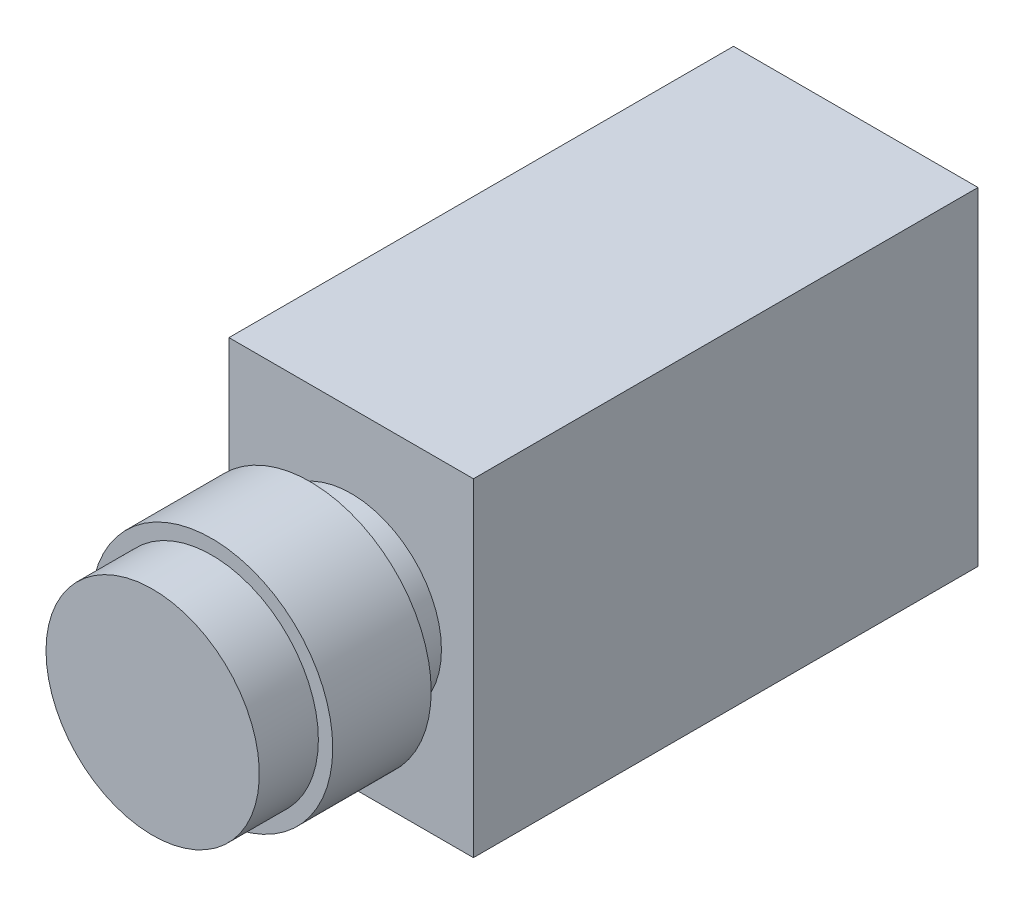
ISO-10303-21;
HEADER;
FILE_DESCRIPTION(('STEP AP214'),'2;1');
FILE_NAME('part.step','',(''),(''),'','','');
FILE_SCHEMA(('AUTOMOTIVE_DESIGN { 1 0 10303 214 1 1 1 1 }'));
ENDSEC;
DATA;
#1=APPLICATION_CONTEXT('core data for automotive mechanical design processes');
#2=APPLICATION_PROTOCOL_DEFINITION('international standard','automotive_design',2000,#1);
#3=PRODUCT_CONTEXT('',#1,'mechanical');
#4=PRODUCT('Part','Part','',(#3));
#5=PRODUCT_RELATED_PRODUCT_CATEGORY('part','',(#4));
#6=PRODUCT_DEFINITION_FORMATION('','',#4);
#7=PRODUCT_DEFINITION_CONTEXT('part definition',#1,'design');
#8=PRODUCT_DEFINITION('design','',#6,#7);
#9=PRODUCT_DEFINITION_SHAPE('','',#8);
#10=(LENGTH_UNIT() NAMED_UNIT(*) SI_UNIT(.MILLI.,.METRE.));
#11=(NAMED_UNIT(*) PLANE_ANGLE_UNIT() SI_UNIT($,.RADIAN.));
#12=(NAMED_UNIT(*) SI_UNIT($,.STERADIAN.) SOLID_ANGLE_UNIT());
#13=UNCERTAINTY_MEASURE_WITH_UNIT(LENGTH_MEASURE(1.E-05),#10,'distance_accuracy_value','');
#14=(GEOMETRIC_REPRESENTATION_CONTEXT(3) GLOBAL_UNCERTAINTY_ASSIGNED_CONTEXT((#13)) GLOBAL_UNIT_ASSIGNED_CONTEXT((#10,
#11,#12)) REPRESENTATION_CONTEXT('',''));
#15=CARTESIAN_POINT('',(0.,0.,0.));
#16=DIRECTION('',(0.,0.,1.));
#17=DIRECTION('',(1.,0.,0.));
#18=AXIS2_PLACEMENT_3D('',#15,#16,#17);
#19=CARTESIAN_POINT('',(-14.9,20.,-66.5));
#20=DIRECTION('',(1.,0.,0.));
#21=DIRECTION('',(0.,1.,0.));
#22=AXIS2_PLACEMENT_3D('',#19,#20,#21);
#23=PLANE('',#22);
#24=DIRECTION('',(0.,1.,0.));
#25=VECTOR('',#24,1.);
#26=CARTESIAN_POINT('',(-14.9,20.,-5.));
#27=LINE('',#26,#25);
#28=CARTESIAN_POINT('',(-14.9,-20.,-5.));
#29=VERTEX_POINT('',#28);
#30=CARTESIAN_POINT('',(-14.9,20.,-5.));
#31=VERTEX_POINT('',#30);
#32=EDGE_CURVE('E103',#29,#31,#27,.T.);
#33=ORIENTED_EDGE('',*,*,#32,.T.);
#34=DIRECTION('',(0.,0.,1.));
#35=VECTOR('',#34,1.);
#36=CARTESIAN_POINT('',(-14.9,20.,-66.5));
#37=LINE('',#36,#35);
#38=CARTESIAN_POINT('',(-14.9,20.,-66.5));
#39=VERTEX_POINT('',#38);
#40=EDGE_CURVE('E12',#39,#31,#37,.T.);
#41=ORIENTED_EDGE('',*,*,#40,.F.);
#42=DIRECTION('',(0.,1.,0.));
#43=VECTOR('',#42,1.);
#44=CARTESIAN_POINT('',(-14.9,20.,-66.5));
#45=LINE('',#44,#43);
#46=CARTESIAN_POINT('',(-14.9,-20.,-66.5));
#47=VERTEX_POINT('',#46);
#48=EDGE_CURVE('E91',#47,#39,#45,.T.);
#49=ORIENTED_EDGE('',*,*,#48,.F.);
#50=DIRECTION('',(0.,0.,1.));
#51=VECTOR('',#50,1.);
#52=CARTESIAN_POINT('',(-14.9,-20.,-66.5));
#53=LINE('',#52,#51);
#54=EDGE_CURVE('E99',#47,#29,#53,.T.);
#55=ORIENTED_EDGE('',*,*,#54,.T.);
#56=EDGE_LOOP('',(#33,#41,#49,#55));
#57=FACE_BOUND('',#56,.T.);
#58=ADVANCED_FACE('F40',(#57),#23,.F.);
#59=CARTESIAN_POINT('',(14.9,20.,-66.5));
#60=DIRECTION('',(0.,-1.,0.));
#61=DIRECTION('',(0.,0.,-1.));
#62=AXIS2_PLACEMENT_3D('',#59,#60,#61);
#63=PLANE('',#62);
#64=DIRECTION('',(1.,0.,0.));
#65=VECTOR('',#64,1.);
#66=CARTESIAN_POINT('',(14.9,20.,-5.));
#67=LINE('',#66,#65);
#68=CARTESIAN_POINT('',(14.9,20.,-5.));
#69=VERTEX_POINT('',#68);
#70=EDGE_CURVE('E95',#31,#69,#67,.T.);
#71=ORIENTED_EDGE('',*,*,#70,.T.);
#72=DIRECTION('',(0.,0.,1.));
#73=VECTOR('',#72,1.);
#74=CARTESIAN_POINT('',(14.9,20.,-66.5));
#75=LINE('',#74,#73);
#76=CARTESIAN_POINT('',(14.9,20.,-66.5));
#77=VERTEX_POINT('',#76);
#78=EDGE_CURVE('E48',#77,#69,#75,.T.);
#79=ORIENTED_EDGE('',*,*,#78,.F.);
#80=DIRECTION('',(1.,0.,0.));
#81=VECTOR('',#80,1.);
#82=CARTESIAN_POINT('',(14.9,20.,-66.5));
#83=LINE('',#82,#81);
#84=EDGE_CURVE('E86',#39,#77,#83,.T.);
#85=ORIENTED_EDGE('',*,*,#84,.F.);
#86=ORIENTED_EDGE('',*,*,#40,.T.);
#87=EDGE_LOOP('',(#71,#79,#85,#86));
#88=FACE_BOUND('',#87,.T.);
#89=ADVANCED_FACE('F94',(#88),#63,.F.);
#90=CARTESIAN_POINT('',(14.9,20.,-66.5));
#91=DIRECTION('',(-1.,0.,0.));
#92=DIRECTION('',(0.,-1.,0.));
#93=AXIS2_PLACEMENT_3D('',#90,#91,#92);
#94=PLANE('',#93);
#95=DIRECTION('',(0.,-1.,0.));
#96=VECTOR('',#95,1.);
#97=CARTESIAN_POINT('',(14.9,20.,-5.));
#98=LINE('',#97,#96);
#99=CARTESIAN_POINT('',(14.9,-20.,-5.));
#100=VERTEX_POINT('',#99);
#101=EDGE_CURVE('E73',#69,#100,#98,.T.);
#102=ORIENTED_EDGE('',*,*,#101,.T.);
#103=DIRECTION('',(0.,0.,1.));
#104=VECTOR('',#103,1.);
#105=CARTESIAN_POINT('',(14.9,-20.,-66.5));
#106=LINE('',#105,#104);
#107=CARTESIAN_POINT('',(14.9,-20.,-66.5));
#108=VERTEX_POINT('',#107);
#109=EDGE_CURVE('E96',#108,#100,#106,.T.);
#110=ORIENTED_EDGE('',*,*,#109,.F.);
#111=DIRECTION('',(0.,-1.,0.));
#112=VECTOR('',#111,1.);
#113=CARTESIAN_POINT('',(14.9,20.,-66.5));
#114=LINE('',#113,#112);
#115=EDGE_CURVE('E89',#77,#108,#114,.T.);
#116=ORIENTED_EDGE('',*,*,#115,.F.);
#117=ORIENTED_EDGE('',*,*,#78,.T.);
#118=EDGE_LOOP('',(#102,#110,#116,#117));
#119=FACE_BOUND('',#118,.T.);
#120=ADVANCED_FACE('F97',(#119),#94,.F.);
#121=CARTESIAN_POINT('',(14.9,-20.,-66.5));
#122=DIRECTION('',(0.,1.,0.));
#123=DIRECTION('',(0.,0.,1.));
#124=AXIS2_PLACEMENT_3D('',#121,#122,#123);
#125=PLANE('',#124);
#126=DIRECTION('',(-1.,0.,0.));
#127=VECTOR('',#126,1.);
#128=CARTESIAN_POINT('',(14.9,-20.,-5.));
#129=LINE('',#128,#127);
#130=EDGE_CURVE('E79',#100,#29,#129,.T.);
#131=ORIENTED_EDGE('',*,*,#130,.T.);
#132=ORIENTED_EDGE('',*,*,#54,.F.);
#133=DIRECTION('',(-1.,0.,0.));
#134=VECTOR('',#133,1.);
#135=CARTESIAN_POINT('',(14.9,-20.,-66.5));
#136=LINE('',#135,#134);
#137=EDGE_CURVE('E56',#108,#47,#136,.T.);
#138=ORIENTED_EDGE('',*,*,#137,.F.);
#139=ORIENTED_EDGE('',*,*,#109,.T.);
#140=EDGE_LOOP('',(#131,#132,#138,#139));
#141=FACE_BOUND('',#140,.T.);
#142=ADVANCED_FACE('F110',(#141),#125,.F.);
#143=CARTESIAN_POINT('',(0.,0.,-66.5));
#144=DIRECTION('',(0.,0.,-1.));
#145=DIRECTION('',(-1.,0.,0.));
#146=AXIS2_PLACEMENT_3D('',#143,#144,#145);
#147=PLANE('',#146);
#148=ORIENTED_EDGE('',*,*,#48,.T.);
#149=ORIENTED_EDGE('',*,*,#84,.T.);
#150=ORIENTED_EDGE('',*,*,#115,.T.);
#151=ORIENTED_EDGE('',*,*,#137,.T.);
#152=EDGE_LOOP('',(#148,#149,#150,#151));
#153=FACE_BOUND('',#152,.T.);
#154=ADVANCED_FACE('F87',(#153),#147,.T.);
#155=CARTESIAN_POINT('',(0.,0.,-5.));
#156=DIRECTION('',(0.,0.,-1.));
#157=DIRECTION('',(-1.,0.,0.));
#158=AXIS2_PLACEMENT_3D('',#155,#156,#157);
#159=PLANE('',#158);
#160=ORIENTED_EDGE('',*,*,#32,.F.);
#161=ORIENTED_EDGE('',*,*,#130,.F.);
#162=ORIENTED_EDGE('',*,*,#101,.F.);
#163=ORIENTED_EDGE('',*,*,#70,.F.);
#164=EDGE_LOOP('',(#160,#161,#162,#163));
#165=FACE_BOUND('',#164,.T.);
#166=ADVANCED_FACE('F113',(#165),#159,.F.);
#167=CLOSED_SHELL('',(#58,#89,#120,#142,#154,#166));
#168=MANIFOLD_SOLID_BREP('B2',#167);
#169=CARTESIAN_POINT('',(0.,0.,0.));
#170=DIRECTION('',(0.,0.,1.));
#171=DIRECTION('',(1.,0.,0.));
#172=AXIS2_PLACEMENT_3D('',#169,#170,#171);
#173=PLANE('',#172);
#174=CARTESIAN_POINT('',(0.,0.,0.));
#175=DIRECTION('',(0.,0.,1.));
#176=DIRECTION('',(1.,0.,0.));
#177=AXIS2_PLACEMENT_3D('',#174,#175,#176);
#178=CIRCLE('',#177,14.75);
#179=CARTESIAN_POINT('',(14.75,0.,0.));
#180=VERTEX_POINT('',#179);
#181=EDGE_CURVE('E179',#180,#180,#178,.T.);
#182=ORIENTED_EDGE('',*,*,#181,.F.);
#183=EDGE_LOOP('',(#182));
#184=FACE_BOUND('',#183,.T.);
#185=CARTESIAN_POINT('',(0.,0.,0.));
#186=DIRECTION('',(0.,0.,1.));
#187=DIRECTION('',(1.,0.,0.));
#188=AXIS2_PLACEMENT_3D('',#185,#186,#187);
#189=CIRCLE('',#188,11.);
#190=CARTESIAN_POINT('',(11.,0.,0.));
#191=VERTEX_POINT('',#190);
#192=EDGE_CURVE('E39',#191,#191,#189,.F.);
#193=ORIENTED_EDGE('',*,*,#192,.F.);
#194=EDGE_LOOP('',(#193));
#195=FACE_BOUND('',#194,.T.);
#196=ADVANCED_FACE('F163',(#184,#195),#173,.F.);
#197=CARTESIAN_POINT('',(0.,0.,12.));
#198=DIRECTION('',(0.,0.,-1.));
#199=DIRECTION('',(-1.,0.,0.));
#200=AXIS2_PLACEMENT_3D('',#197,#198,#199);
#201=CYLINDRICAL_SURFACE('',#200,14.75);
#202=CARTESIAN_POINT('',(0.,0.,12.));
#203=DIRECTION('',(0.,0.,1.));
#204=DIRECTION('',(1.,0.,0.));
#205=AXIS2_PLACEMENT_3D('',#202,#203,#204);
#206=CIRCLE('',#205,14.75);
#207=CARTESIAN_POINT('',(14.75,0.,12.));
#208=VERTEX_POINT('',#207);
#209=EDGE_CURVE('E174',#208,#208,#206,.T.);
#210=ORIENTED_EDGE('',*,*,#209,.F.);
#211=EDGE_LOOP('',(#210));
#212=FACE_BOUND('',#211,.T.);
#213=ORIENTED_EDGE('',*,*,#181,.T.);
#214=EDGE_LOOP('',(#213));
#215=FACE_BOUND('',#214,.T.);
#216=ADVANCED_FACE('F165',(#212,#215),#201,.T.);
#217=CARTESIAN_POINT('',(0.,0.,12.));
#218=DIRECTION('',(0.,0.,1.));
#219=DIRECTION('',(1.,0.,0.));
#220=AXIS2_PLACEMENT_3D('',#217,#218,#219);
#221=PLANE('',#220);
#222=CARTESIAN_POINT('',(0.,0.,12.));
#223=DIRECTION('',(0.,0.,1.));
#224=DIRECTION('',(1.,0.,0.));
#225=AXIS2_PLACEMENT_3D('',#222,#223,#224);
#226=CIRCLE('',#225,13.);
#227=CARTESIAN_POINT('',(13.,0.,12.));
#228=VERTEX_POINT('',#227);
#229=EDGE_CURVE('E170',#228,#228,#226,.T.);
#230=ORIENTED_EDGE('',*,*,#229,.F.);
#231=EDGE_LOOP('',(#230));
#232=FACE_BOUND('',#231,.T.);
#233=ORIENTED_EDGE('',*,*,#209,.T.);
#234=EDGE_LOOP('',(#233));
#235=FACE_BOUND('',#234,.T.);
#236=ADVANCED_FACE('F213',(#232,#235),#221,.T.);
#237=CARTESIAN_POINT('',(0.,0.,19.2));
#238=DIRECTION('',(0.,0.,-1.));
#239=DIRECTION('',(-1.,0.,0.));
#240=AXIS2_PLACEMENT_3D('',#237,#238,#239);
#241=CYLINDRICAL_SURFACE('',#240,13.);
#242=ORIENTED_EDGE('',*,*,#229,.T.);
#243=EDGE_LOOP('',(#242));
#244=FACE_BOUND('',#243,.T.);
#245=CARTESIAN_POINT('',(0.,0.,19.2));
#246=DIRECTION('',(0.,0.,-1.));
#247=DIRECTION('',(-1.,0.,0.));
#248=AXIS2_PLACEMENT_3D('',#245,#246,#247);
#249=CIRCLE('',#248,13.);
#250=CARTESIAN_POINT('',(-13.,0.,19.2));
#251=VERTEX_POINT('',#250);
#252=EDGE_CURVE('E182',#251,#251,#249,.T.);
#253=ORIENTED_EDGE('',*,*,#252,.T.);
#254=EDGE_LOOP('',(#253));
#255=FACE_BOUND('',#254,.T.);
#256=ADVANCED_FACE('F205',(#244,#255),#241,.T.);
#257=CARTESIAN_POINT('',(0.,0.,19.2));
#258=DIRECTION('',(0.,0.,-1.));
#259=DIRECTION('',(-1.,0.,0.));
#260=AXIS2_PLACEMENT_3D('',#257,#258,#259);
#261=PLANE('',#260);
#262=ORIENTED_EDGE('',*,*,#252,.F.);
#263=EDGE_LOOP('',(#262));
#264=FACE_BOUND('',#263,.T.);
#265=ADVANCED_FACE('F198',(#264),#261,.F.);
#266=CARTESIAN_POINT('',(0.,0.,-61.5));
#267=DIRECTION('',(0.,0.,1.));
#268=DIRECTION('',(1.,0.,0.));
#269=AXIS2_PLACEMENT_3D('',#266,#267,#268);
#270=CYLINDRICAL_SURFACE('',#269,11.);
#271=CARTESIAN_POINT('',(0.,0.,-61.5));
#272=DIRECTION('',(0.,0.,-1.));
#273=DIRECTION('',(-1.,0.,0.));
#274=AXIS2_PLACEMENT_3D('',#271,#272,#273);
#275=CIRCLE('',#274,11.);
#276=CARTESIAN_POINT('',(-11.,0.,-61.5));
#277=VERTEX_POINT('',#276);
#278=EDGE_CURVE('E188',#277,#277,#275,.T.);
#279=ORIENTED_EDGE('',*,*,#278,.F.);
#280=EDGE_LOOP('',(#279));
#281=FACE_BOUND('',#280,.T.);
#282=ORIENTED_EDGE('',*,*,#192,.T.);
#283=EDGE_LOOP('',(#282));
#284=FACE_BOUND('',#283,.T.);
#285=ADVANCED_FACE('F196',(#281,#284),#270,.T.);
#286=CARTESIAN_POINT('',(0.,0.,-61.5));
#287=DIRECTION('',(0.,0.,-1.));
#288=DIRECTION('',(-1.,0.,0.));
#289=AXIS2_PLACEMENT_3D('',#286,#287,#288);
#290=PLANE('',#289);
#291=ORIENTED_EDGE('',*,*,#278,.T.);
#292=EDGE_LOOP('',(#291));
#293=FACE_BOUND('',#292,.T.);
#294=ADVANCED_FACE('F194',(#293),#290,.T.);
#295=CLOSED_SHELL('',(#196,#216,#236,#256,#265,#285,#294));
#296=MANIFOLD_SOLID_BREP('B6',#295);
#297=ADVANCED_BREP_SHAPE_REPRESENTATION('',(#18,#168,#296),#14);
#298=SHAPE_DEFINITION_REPRESENTATION(#9,#297);
ENDSEC;
END-ISO-10303-21;
